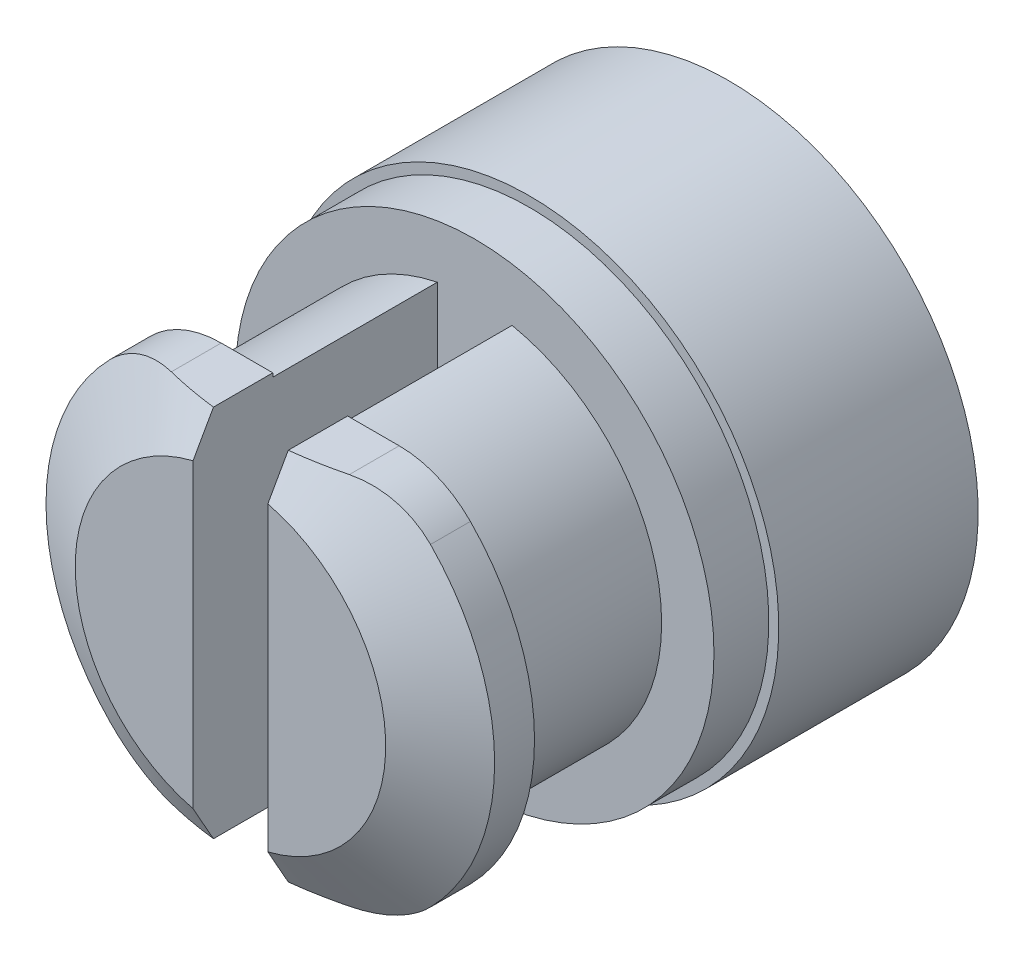
ISO-10303-21;
HEADER;
FILE_DESCRIPTION(('STEP AP214'),'2;1');
FILE_NAME('part.step','',(''),(''),'','','');
FILE_SCHEMA(('AUTOMOTIVE_DESIGN { 1 0 10303 214 1 1 1 1 }'));
ENDSEC;
DATA;
#1=APPLICATION_CONTEXT('core data for automotive mechanical design processes');
#2=APPLICATION_PROTOCOL_DEFINITION('international standard','automotive_design',2000,#1);
#3=PRODUCT_CONTEXT('',#1,'mechanical');
#4=PRODUCT('Part','Part','',(#3));
#5=PRODUCT_RELATED_PRODUCT_CATEGORY('part','',(#4));
#6=PRODUCT_DEFINITION_FORMATION('','',#4);
#7=PRODUCT_DEFINITION_CONTEXT('part definition',#1,'design');
#8=PRODUCT_DEFINITION('design','',#6,#7);
#9=PRODUCT_DEFINITION_SHAPE('','',#8);
#10=(LENGTH_UNIT() NAMED_UNIT(*) SI_UNIT(.MILLI.,.METRE.));
#11=(NAMED_UNIT(*) PLANE_ANGLE_UNIT() SI_UNIT($,.RADIAN.));
#12=(NAMED_UNIT(*) SI_UNIT($,.STERADIAN.) SOLID_ANGLE_UNIT());
#13=UNCERTAINTY_MEASURE_WITH_UNIT(LENGTH_MEASURE(1.E-05),#10,'distance_accuracy_value','');
#14=(GEOMETRIC_REPRESENTATION_CONTEXT(3) GLOBAL_UNCERTAINTY_ASSIGNED_CONTEXT((#13)) GLOBAL_UNIT_ASSIGNED_CONTEXT((#10,
#11,#12)) REPRESENTATION_CONTEXT('',''));
#15=CARTESIAN_POINT('',(0.,0.,0.));
#16=DIRECTION('',(0.,0.,1.));
#17=DIRECTION('',(1.,0.,0.));
#18=AXIS2_PLACEMENT_3D('',#15,#16,#17);
#19=CARTESIAN_POINT('',(0.,0.,3.));
#20=DIRECTION('',(0.,0.,-1.));
#21=DIRECTION('',(-1.,0.,0.));
#22=AXIS2_PLACEMENT_3D('',#19,#20,#21);
#23=CYLINDRICAL_SURFACE('',#22,2.25);
#24=CARTESIAN_POINT('',(0.,0.,2.2));
#25=DIRECTION('',(0.,0.,1.));
#26=DIRECTION('',(1.,0.,0.));
#27=AXIS2_PLACEMENT_3D('',#24,#25,#26);
#28=CIRCLE('',#27,2.25);
#29=CARTESIAN_POINT('',(1.60682139642214,-1.575,2.2));
#30=VERTEX_POINT('',#29);
#31=CARTESIAN_POINT('',(1.60682139642214,1.575,2.2));
#32=VERTEX_POINT('',#31);
#33=EDGE_CURVE('E313',#30,#32,#28,.T.);
#34=ORIENTED_EDGE('',*,*,#33,.T.);
#35=DIRECTION('',(0.,0.,-1.));
#36=VECTOR('',#35,1.);
#37=CARTESIAN_POINT('',(1.60682139642214,1.575,3.));
#38=LINE('',#37,#36);
#39=CARTESIAN_POINT('',(1.60682139642214,1.575,2.6));
#40=VERTEX_POINT('',#39);
#41=EDGE_CURVE('E271',#32,#40,#38,.F.);
#42=ORIENTED_EDGE('',*,*,#41,.T.);
#43=CARTESIAN_POINT('',(0.,0.,2.6));
#44=DIRECTION('',(0.,0.,1.));
#45=DIRECTION('',(1.,0.,0.));
#46=AXIS2_PLACEMENT_3D('',#43,#44,#45);
#47=CIRCLE('',#46,2.25);
#48=CARTESIAN_POINT('',(1.60682139642214,-1.575,2.6));
#49=VERTEX_POINT('',#48);
#50=EDGE_CURVE('E239',#40,#49,#47,.F.);
#51=ORIENTED_EDGE('',*,*,#50,.T.);
#52=DIRECTION('',(0.,0.,-1.));
#53=VECTOR('',#52,1.);
#54=CARTESIAN_POINT('',(1.60682139642214,-1.575,3.));
#55=LINE('',#54,#53);
#56=EDGE_CURVE('E308',#49,#30,#55,.T.);
#57=ORIENTED_EDGE('',*,*,#56,.T.);
#58=EDGE_LOOP('',(#34,#42,#51,#57));
#59=FACE_BOUND('',#58,.T.);
#60=ADVANCED_FACE('F33',(#59),#23,.T.);
#61=CARTESIAN_POINT('',(0.,0.,2.2));
#62=DIRECTION('',(0.,0.,1.));
#63=DIRECTION('',(1.,0.,0.));
#64=AXIS2_PLACEMENT_3D('',#61,#62,#63);
#65=PLANE('',#64);
#66=DIRECTION('',(-1.,0.,0.));
#67=VECTOR('',#66,1.);
#68=CARTESIAN_POINT('',(0.,1.875,2.2));
#69=LINE('',#68,#67);
#70=CARTESIAN_POINT('',(0.892678553567856,1.875,2.2));
#71=VERTEX_POINT('',#70);
#72=CARTESIAN_POINT('',(0.375,1.875,2.2));
#73=VERTEX_POINT('',#72);
#74=EDGE_CURVE('E160',#71,#73,#69,.T.);
#75=ORIENTED_EDGE('',*,*,#74,.F.);
#76=CARTESIAN_POINT('',(0.892678553567856,0.875,2.2));
#77=DIRECTION('',(0.,0.,1.));
#78=DIRECTION('',(1.,0.,0.));
#79=AXIS2_PLACEMENT_3D('',#76,#77,#78);
#80=CIRCLE('',#79,1.);
#81=EDGE_CURVE('E307',#71,#32,#80,.F.);
#82=ORIENTED_EDGE('',*,*,#81,.T.);
#83=ORIENTED_EDGE('',*,*,#33,.F.);
#84=CARTESIAN_POINT('',(0.892678553567856,-0.875,2.2));
#85=DIRECTION('',(0.,0.,1.));
#86=DIRECTION('',(1.,0.,0.));
#87=AXIS2_PLACEMENT_3D('',#84,#85,#86);
#88=CIRCLE('',#87,1.);
#89=CARTESIAN_POINT('',(0.892678553567856,-1.875,2.2));
#90=VERTEX_POINT('',#89);
#91=EDGE_CURVE('E305',#30,#90,#88,.F.);
#92=ORIENTED_EDGE('',*,*,#91,.T.);
#93=DIRECTION('',(1.,0.,0.));
#94=VECTOR('',#93,1.);
#95=CARTESIAN_POINT('',(0.,-1.875,2.2));
#96=LINE('',#95,#94);
#97=CARTESIAN_POINT('',(0.375,-1.875,2.2));
#98=VERTEX_POINT('',#97);
#99=EDGE_CURVE('E323',#98,#90,#96,.T.);
#100=ORIENTED_EDGE('',*,*,#99,.F.);
#101=DIRECTION('',(0.,1.,0.));
#102=VECTOR('',#101,1.);
#103=CARTESIAN_POINT('',(0.375,0.,2.2));
#104=LINE('',#103,#102);
#105=CARTESIAN_POINT('',(0.375,-1.83711730708738,2.2));
#106=VERTEX_POINT('',#105);
#107=EDGE_CURVE('E185',#98,#106,#104,.T.);
#108=ORIENTED_EDGE('',*,*,#107,.T.);
#109=CARTESIAN_POINT('',(0.,0.,2.2));
#110=DIRECTION('',(0.,0.,1.));
#111=DIRECTION('',(1.,0.,0.));
#112=AXIS2_PLACEMENT_3D('',#109,#110,#111);
#113=CIRCLE('',#112,1.875);
#114=CARTESIAN_POINT('',(0.375,1.83711730708738,2.2));
#115=VERTEX_POINT('',#114);
#116=EDGE_CURVE('E184',#106,#115,#113,.T.);
#117=ORIENTED_EDGE('',*,*,#116,.T.);
#118=EDGE_CURVE('E175',#115,#73,#104,.T.);
#119=ORIENTED_EDGE('',*,*,#118,.T.);
#120=EDGE_LOOP('',(#75,#82,#83,#92,#100,#108,#117,#119));
#121=FACE_BOUND('',#120,.T.);
#122=ADVANCED_FACE('F182',(#121),#65,.F.);
#123=CARTESIAN_POINT('',(0.,0.,2.6));
#124=DIRECTION('',(0.,0.,1.));
#125=DIRECTION('',(1.,0.,0.));
#126=AXIS2_PLACEMENT_3D('',#123,#124,#125);
#127=CIRCLE('',#126,2.25);
#128=CARTESIAN_POINT('',(-1.60682139642214,-1.575,2.6));
#129=VERTEX_POINT('',#128);
#130=CARTESIAN_POINT('',(-1.60682139642214,1.575,2.6));
#131=VERTEX_POINT('',#130);
#132=EDGE_CURVE('E333',#129,#131,#127,.F.);
#133=ORIENTED_EDGE('',*,*,#132,.T.);
#134=DIRECTION('',(0.,0.,-1.));
#135=VECTOR('',#134,1.);
#136=CARTESIAN_POINT('',(-1.60682139642214,1.575,3.));
#137=LINE('',#136,#135);
#138=CARTESIAN_POINT('',(-1.60682139642214,1.575,2.2));
#139=VERTEX_POINT('',#138);
#140=EDGE_CURVE('E298',#131,#139,#137,.T.);
#141=ORIENTED_EDGE('',*,*,#140,.T.);
#142=CARTESIAN_POINT('',(-1.60682139642214,-1.575,2.2));
#143=VERTEX_POINT('',#142);
#144=EDGE_CURVE('E318',#139,#143,#28,.T.);
#145=ORIENTED_EDGE('',*,*,#144,.T.);
#146=DIRECTION('',(0.,0.,-1.));
#147=VECTOR('',#146,1.);
#148=CARTESIAN_POINT('',(-1.60682139642214,-1.575,3.));
#149=LINE('',#148,#147);
#150=EDGE_CURVE('E296',#143,#129,#149,.F.);
#151=ORIENTED_EDGE('',*,*,#150,.T.);
#152=EDGE_LOOP('',(#133,#141,#145,#151));
#153=FACE_BOUND('',#152,.T.);
#154=ADVANCED_FACE('F418',(#153),#23,.T.);
#155=ORIENTED_EDGE('',*,*,#144,.F.);
#156=CARTESIAN_POINT('',(-0.892678553567856,0.875,2.2));
#157=DIRECTION('',(0.,0.,1.));
#158=DIRECTION('',(1.,0.,0.));
#159=AXIS2_PLACEMENT_3D('',#156,#157,#158);
#160=CIRCLE('',#159,1.);
#161=CARTESIAN_POINT('',(-0.892678553567856,1.875,2.2));
#162=VERTEX_POINT('',#161);
#163=EDGE_CURVE('E302',#139,#162,#160,.F.);
#164=ORIENTED_EDGE('',*,*,#163,.T.);
#165=DIRECTION('',(-1.,0.,0.));
#166=VECTOR('',#165,1.);
#167=CARTESIAN_POINT('',(0.,1.875,2.2));
#168=LINE('',#167,#166);
#169=CARTESIAN_POINT('',(-0.375,1.875,2.2));
#170=VERTEX_POINT('',#169);
#171=EDGE_CURVE('E439',#170,#162,#168,.T.);
#172=ORIENTED_EDGE('',*,*,#171,.F.);
#173=DIRECTION('',(0.,-1.,0.));
#174=VECTOR('',#173,1.);
#175=CARTESIAN_POINT('',(-0.375,0.,2.2));
#176=LINE('',#175,#174);
#177=CARTESIAN_POINT('',(-0.375,1.83711730708738,2.2));
#178=VERTEX_POINT('',#177);
#179=EDGE_CURVE('E186',#170,#178,#176,.T.);
#180=ORIENTED_EDGE('',*,*,#179,.T.);
#181=CARTESIAN_POINT('',(-0.375,-1.83711730708738,2.2));
#182=VERTEX_POINT('',#181);
#183=EDGE_CURVE('E367',#178,#182,#113,.T.);
#184=ORIENTED_EDGE('',*,*,#183,.T.);
#185=CARTESIAN_POINT('',(-0.375,-1.875,2.2));
#186=VERTEX_POINT('',#185);
#187=EDGE_CURVE('E189',#182,#186,#176,.T.);
#188=ORIENTED_EDGE('',*,*,#187,.T.);
#189=DIRECTION('',(1.,0.,0.));
#190=VECTOR('',#189,1.);
#191=CARTESIAN_POINT('',(0.,-1.875,2.2));
#192=LINE('',#191,#190);
#193=CARTESIAN_POINT('',(-0.892678553567856,-1.875,2.2));
#194=VERTEX_POINT('',#193);
#195=EDGE_CURVE('E335',#194,#186,#192,.T.);
#196=ORIENTED_EDGE('',*,*,#195,.F.);
#197=CARTESIAN_POINT('',(-0.892678553567856,-0.875,2.2));
#198=DIRECTION('',(0.,0.,1.));
#199=DIRECTION('',(1.,0.,0.));
#200=AXIS2_PLACEMENT_3D('',#197,#198,#199);
#201=CIRCLE('',#200,1.);
#202=EDGE_CURVE('E300',#194,#143,#201,.F.);
#203=ORIENTED_EDGE('',*,*,#202,.T.);
#204=EDGE_LOOP('',(#155,#164,#172,#180,#184,#188,#196,#203));
#205=FACE_BOUND('',#204,.T.);
#206=ADVANCED_FACE('F224',(#205),#65,.F.);
#207=CARTESIAN_POINT('',(0.375,-3.03688498979674,-5.56990047018831));
#208=DIRECTION('',(1.,0.,0.));
#209=DIRECTION('',(0.,0.,-1.));
#210=AXIS2_PLACEMENT_3D('',#207,#208,#209);
#211=PLANE('',#210);
#212=DIRECTION('',(0.,0.,-1.));
#213=VECTOR('',#212,1.);
#214=CARTESIAN_POINT('',(0.375,-1.875,-5.56990047018831));
#215=LINE('',#214,#213);
#216=CARTESIAN_POINT('',(0.374999999984532,-1.875,2.79506799738743));
#217=VERTEX_POINT('',#216);
#218=EDGE_CURVE('E444',#217,#98,#215,.T.);
#219=ORIENTED_EDGE('',*,*,#218,.F.);
#220=CARTESIAN_POINT('',(0.375,-2.21852991866236,2.6));
#221=CARTESIAN_POINT('',(0.375,-2.15968993372952,2.63349497391052));
#222=CARTESIAN_POINT('',(0.375,-2.1008350115622,2.66696375090653));
#223=CARTESIAN_POINT('',(0.375,-1.98308452700175,2.73382935955814));
#224=CARTESIAN_POINT('',(0.375,-1.9241889647183,2.76722619140692));
#225=CARTESIAN_POINT('',(0.375,-1.80634603920087,2.83392858311246));
#226=CARTESIAN_POINT('',(0.375,-1.7473986758978,2.86723414284722));
#227=CARTESIAN_POINT('',(0.375,-1.6294330290731,2.93371977517085));
#228=CARTESIAN_POINT('',(0.375,-1.57041474535898,2.9668998474181));
#229=CARTESIAN_POINT('',(0.375,-1.51135156279934,3.));
#230=B_SPLINE_CURVE_WITH_KNOTS('',3,(#220,#221,#222,#223,#224,#225,#226,#227,#228,#229),
.UNSPECIFIED.,.F.,.F.,(4,2,2,2,4),(0.,0.203117017816693,0.406233489563518,0.60935023263841,
0.812467528260209),.UNSPECIFIED.);
#231=CARTESIAN_POINT('',(0.375,-1.51135156279934,3.));
#232=VERTEX_POINT('',#231);
#233=EDGE_CURVE('E229',#217,#232,#230,.T.);
#234=ORIENTED_EDGE('',*,*,#233,.T.);
#235=DIRECTION('',(0.,1.,0.));
#236=VECTOR('',#235,1.);
#237=CARTESIAN_POINT('',(0.375,-3.03688498979674,3.));
#238=LINE('',#237,#236);
#239=CARTESIAN_POINT('',(0.375,1.51135156279934,3.));
#240=VERTEX_POINT('',#239);
#241=EDGE_CURVE('E332',#232,#240,#238,.T.);
#242=ORIENTED_EDGE('',*,*,#241,.T.);
#243=CARTESIAN_POINT('',(0.375,1.51135156279934,3.));
#244=CARTESIAN_POINT('',(0.375,1.57041474535898,2.9668998474181));
#245=CARTESIAN_POINT('',(0.375,1.6294330290731,2.93371977517085));
#246=CARTESIAN_POINT('',(0.375,1.7473986758978,2.86723414284722));
#247=CARTESIAN_POINT('',(0.375,1.80634603920088,2.83392858311246));
#248=CARTESIAN_POINT('',(0.375,1.9241889647183,2.76722619140692));
#249=CARTESIAN_POINT('',(0.375,1.98308452700175,2.73382935955814));
#250=CARTESIAN_POINT('',(0.375,2.1008350115622,2.66696375090653));
#251=CARTESIAN_POINT('',(0.375,2.15968993372952,2.63349497391052));
#252=CARTESIAN_POINT('',(0.375,2.21852991866236,2.6));
#253=B_SPLINE_CURVE_WITH_KNOTS('',3,(#243,#244,#245,#246,#247,#248,#249,#250,#251,#252),
.UNSPECIFIED.,.F.,.F.,(4,2,2,2,4),(0.,0.203117295621798,0.406234038696691,0.609350510443516,
0.812467528260209),.UNSPECIFIED.);
#254=CARTESIAN_POINT('',(0.375,1.875,2.79506799738568));
#255=VERTEX_POINT('',#254);
#256=EDGE_CURVE('E178',#240,#255,#253,.T.);
#257=ORIENTED_EDGE('',*,*,#256,.T.);
#258=DIRECTION('',(0.,0.,1.));
#259=VECTOR('',#258,1.);
#260=CARTESIAN_POINT('',(0.375,1.875,-5.56990047018831));
#261=LINE('',#260,#259);
#262=EDGE_CURVE('E164',#73,#255,#261,.T.);
#263=ORIENTED_EDGE('',*,*,#262,.F.);
#264=ORIENTED_EDGE('',*,*,#118,.F.);
#265=DIRECTION('',(0.,0.,-1.));
#266=VECTOR('',#265,1.);
#267=CARTESIAN_POINT('',(0.375,1.83711730708738,2.2));
#268=LINE('',#267,#266);
#269=CARTESIAN_POINT('',(0.375,1.83711730708738,0.55));
#270=VERTEX_POINT('',#269);
#271=EDGE_CURVE('E352',#270,#115,#268,.F.);
#272=ORIENTED_EDGE('',*,*,#271,.F.);
#273=DIRECTION('',(0.,-1.,0.));
#274=VECTOR('',#273,1.);
#275=CARTESIAN_POINT('',(0.375,-3.03688498979674,0.55));
#276=LINE('',#275,#274);
#277=CARTESIAN_POINT('',(0.375,-1.83711730708738,0.55));
#278=VERTEX_POINT('',#277);
#279=EDGE_CURVE('E343',#270,#278,#276,.T.);
#280=ORIENTED_EDGE('',*,*,#279,.T.);
#281=DIRECTION('',(0.,0.,-1.));
#282=VECTOR('',#281,1.);
#283=CARTESIAN_POINT('',(0.375,-1.83711730708738,2.2));
#284=LINE('',#283,#282);
#285=EDGE_CURVE('E319',#106,#278,#284,.T.);
#286=ORIENTED_EDGE('',*,*,#285,.F.);
#287=ORIENTED_EDGE('',*,*,#107,.F.);
#288=EDGE_LOOP('',(#219,#234,#242,#257,#263,#264,#272,#280,#286,#287));
#289=FACE_BOUND('',#288,.T.);
#290=ADVANCED_FACE('F174',(#289),#211,.F.);
#291=CARTESIAN_POINT('',(-0.375,-3.03688498979674,-5.56990047018831));
#292=DIRECTION('',(-1.,0.,0.));
#293=DIRECTION('',(0.,0.,1.));
#294=AXIS2_PLACEMENT_3D('',#291,#292,#293);
#295=PLANE('',#294);
#296=DIRECTION('',(0.,0.,1.));
#297=VECTOR('',#296,1.);
#298=CARTESIAN_POINT('',(-0.375,-1.875,-5.56990047018831));
#299=LINE('',#298,#297);
#300=CARTESIAN_POINT('',(-0.375,-1.875,2.79506799738568));
#301=VERTEX_POINT('',#300);
#302=EDGE_CURVE('E340',#186,#301,#299,.T.);
#303=ORIENTED_EDGE('',*,*,#302,.F.);
#304=ORIENTED_EDGE('',*,*,#187,.F.);
#305=DIRECTION('',(0.,0.,-1.));
#306=VECTOR('',#305,1.);
#307=CARTESIAN_POINT('',(-0.375,-1.83711730708738,2.2));
#308=LINE('',#307,#306);
#309=CARTESIAN_POINT('',(-0.375,-1.83711730708738,0.55));
#310=VERTEX_POINT('',#309);
#311=EDGE_CURVE('E346',#310,#182,#308,.F.);
#312=ORIENTED_EDGE('',*,*,#311,.F.);
#313=DIRECTION('',(0.,1.,0.));
#314=VECTOR('',#313,1.);
#315=CARTESIAN_POINT('',(-0.375,-3.03688498979674,0.55));
#316=LINE('',#315,#314);
#317=CARTESIAN_POINT('',(-0.375,1.83711730708738,0.55));
#318=VERTEX_POINT('',#317);
#319=EDGE_CURVE('E338',#310,#318,#316,.T.);
#320=ORIENTED_EDGE('',*,*,#319,.T.);
#321=DIRECTION('',(0.,0.,-1.));
#322=VECTOR('',#321,1.);
#323=CARTESIAN_POINT('',(-0.375,1.83711730708738,2.2));
#324=LINE('',#323,#322);
#325=EDGE_CURVE('E349',#178,#318,#324,.T.);
#326=ORIENTED_EDGE('',*,*,#325,.F.);
#327=ORIENTED_EDGE('',*,*,#179,.F.);
#328=DIRECTION('',(0.,0.,-1.));
#329=VECTOR('',#328,1.);
#330=CARTESIAN_POINT('',(-0.375,1.875,-5.56990047018831));
#331=LINE('',#330,#329);
#332=CARTESIAN_POINT('',(-0.374999999984535,1.875,2.79506799738743));
#333=VERTEX_POINT('',#332);
#334=EDGE_CURVE('E443',#333,#170,#331,.T.);
#335=ORIENTED_EDGE('',*,*,#334,.F.);
#336=CARTESIAN_POINT('',(-0.375,2.21852991866236,2.6));
#337=CARTESIAN_POINT('',(-0.375,2.15968993372952,2.63349497391052));
#338=CARTESIAN_POINT('',(-0.375,2.1008350115622,2.66696375090653));
#339=CARTESIAN_POINT('',(-0.375,1.98308452700175,2.73382935955814));
#340=CARTESIAN_POINT('',(-0.375,1.9241889647183,2.76722619140692));
#341=CARTESIAN_POINT('',(-0.375,1.80634603920088,2.83392858311246));
#342=CARTESIAN_POINT('',(-0.375,1.7473986758978,2.86723414284722));
#343=CARTESIAN_POINT('',(-0.375,1.6294330290731,2.93371977517085));
#344=CARTESIAN_POINT('',(-0.375,1.57041474535898,2.9668998474181));
#345=CARTESIAN_POINT('',(-0.375,1.51135156279934,3.));
#346=B_SPLINE_CURVE_WITH_KNOTS('',3,(#336,#337,#338,#339,#340,#341,#342,#343,#344,#345),
.UNSPECIFIED.,.F.,.F.,(4,2,2,2,4),(0.,0.203117017816693,0.406233489563517,0.60935023263841,
0.812467528260208),.UNSPECIFIED.);
#347=CARTESIAN_POINT('',(-0.375,1.51135156279934,3.));
#348=VERTEX_POINT('',#347);
#349=EDGE_CURVE('E195',#333,#348,#346,.T.);
#350=ORIENTED_EDGE('',*,*,#349,.T.);
#351=DIRECTION('',(0.,-1.,0.));
#352=VECTOR('',#351,1.);
#353=CARTESIAN_POINT('',(-0.375,-3.03688498979674,3.));
#354=LINE('',#353,#352);
#355=CARTESIAN_POINT('',(-0.375,-1.51135156279934,3.));
#356=VERTEX_POINT('',#355);
#357=EDGE_CURVE('E334',#348,#356,#354,.T.);
#358=ORIENTED_EDGE('',*,*,#357,.T.);
#359=CARTESIAN_POINT('',(-0.375,-1.51135156279934,3.));
#360=CARTESIAN_POINT('',(-0.375,-1.57041474535898,2.9668998474181));
#361=CARTESIAN_POINT('',(-0.375,-1.6294330290731,2.93371977517085));
#362=CARTESIAN_POINT('',(-0.375,-1.7473986758978,2.86723414284722));
#363=CARTESIAN_POINT('',(-0.375,-1.80634603920088,2.83392858311246));
#364=CARTESIAN_POINT('',(-0.375,-1.9241889647183,2.76722619140692));
#365=CARTESIAN_POINT('',(-0.375,-1.98308452700175,2.73382935955814));
#366=CARTESIAN_POINT('',(-0.375,-2.1008350115622,2.66696375090653));
#367=CARTESIAN_POINT('',(-0.375,-2.15968993372952,2.63349497391052));
#368=CARTESIAN_POINT('',(-0.375,-2.21852991866236,2.6));
#369=B_SPLINE_CURVE_WITH_KNOTS('',3,(#359,#360,#361,#362,#363,#364,#365,#366,#367,#368),
.UNSPECIFIED.,.F.,.F.,(4,2,2,2,4),(0.,0.203117295621798,0.406234038696691,0.609350510443516,
0.812467528260208),.UNSPECIFIED.);
#370=EDGE_CURVE('E202',#356,#301,#369,.T.);
#371=ORIENTED_EDGE('',*,*,#370,.T.);
#372=EDGE_LOOP('',(#303,#304,#312,#320,#326,#327,#335,#350,#358,#371));
#373=FACE_BOUND('',#372,.T.);
#374=ADVANCED_FACE('F211',(#373),#295,.F.);
#375=CARTESIAN_POINT('',(0.,0.,3.));
#376=DIRECTION('',(0.,0.,-1.));
#377=DIRECTION('',(-1.,0.,0.));
#378=AXIS2_PLACEMENT_3D('',#375,#376,#377);
#379=CONICAL_SURFACE('',#378,1.55717967697245,1.0471975511966);
#380=CARTESIAN_POINT('',(0.77551517420227,1.875,2.72756484727964));
#381=CARTESIAN_POINT('',(0.73007828212685,1.875,2.73759139971199));
#382=CARTESIAN_POINT('',(0.684483458480379,1.875,2.746899537944));
#383=CARTESIAN_POINT('',(0.592987609596221,1.875,2.76393435069116));
#384=CARTESIAN_POINT('',(0.547086506149714,1.875,2.77166060396105));
#385=CARTESIAN_POINT('',(0.408946001671618,1.875,2.7922462534341));
#386=CARTESIAN_POINT('',(0.316297737646359,1.875,2.80250610976308));
#387=CARTESIAN_POINT('',(0.132574886718153,1.875,2.81505167553006));
#388=CARTESIAN_POINT('',(0.0415124790875966,1.875,2.81751356952369));
#389=CARTESIAN_POINT('',(-0.140443547775259,1.875,2.81474583153236));
#390=CARTESIAN_POINT('',(-0.231337228826834,1.875,2.8095200636123));
#391=CARTESIAN_POINT('',(-0.455475822604413,1.875,2.78761389509424));
#392=CARTESIAN_POINT('',(-0.588304374029833,1.875,2.76666788057498));
#393=CARTESIAN_POINT('',(-0.851406700487641,1.875,2.7122656984015));
#394=CARTESIAN_POINT('',(-0.981677227305159,1.875,2.67879458684475));
#395=CARTESIAN_POINT('',(-1.17604125726333,1.875,2.62160020743556));
#396=CARTESIAN_POINT('',(-1.24114693883111,1.875,2.60118805420931));
#397=CARTESIAN_POINT('',(-1.37068250354892,1.875,2.55844461124686));
#398=CARTESIAN_POINT('',(-1.43511277578087,1.875,2.53611450327038));
#399=CARTESIAN_POINT('',(-1.62750898786172,1.875,2.46675107355756));
#400=CARTESIAN_POINT('',(-1.75461323428828,1.875,2.41733459221373));
#401=CARTESIAN_POINT('',(-2.01195940339039,1.875,2.31210681333425));
#402=CARTESIAN_POINT('',(-2.142128637828,1.875,2.25612063741134));
#403=CARTESIAN_POINT('',(-2.40101010191744,1.875,2.14084744040797));
#404=CARTESIAN_POINT('',(-2.52972212733652,1.875,2.08155996336499));
#405=CARTESIAN_POINT('',(-2.78257485708802,1.875,1.96227436589369));
#406=CARTESIAN_POINT('',(-2.90674517642836,1.875,1.90233861984275));
#407=CARTESIAN_POINT('',(-3.15421335212192,1.875,1.78081684916808));
#408=CARTESIAN_POINT('',(-3.27751154820572,1.875,1.71923151761987));
#409=CARTESIAN_POINT('',(-3.40051517420227,1.875,1.65707999946831));
#410=B_SPLINE_CURVE_WITH_KNOTS('',3,(#380,#381,#382,#383,#384,#385,#386,#387,#388,#389,#390,
#391,#392,#393,#394,#395,#396,#397,#398,#399,#400,#401,#402,#403,#404,#405,#406,#407,#408,#409),
.UNSPECIFIED.,.F.,.F.,(4,2,2,2,2,2,2,2,2,2,2,2,2,2,4),(0.,0.139580379396184,0.279197879897776,
0.558519829828359,0.8314841235008,1.10431126345209,1.50688805165974,1.90994670040144,
2.11461530128089,2.31915868677931,2.72814235593344,3.153180427448,3.57827734983895,
3.99190030295551,4.40535211655301),.UNSPECIFIED.);
#411=CARTESIAN_POINT('',(-0.892678553567855,1.875,2.70008022484848));
#412=VERTEX_POINT('',#411);
#413=EDGE_CURVE('E170',#333,#412,#410,.T.);
#414=ORIENTED_EDGE('',*,*,#413,.T.);
#415=CARTESIAN_POINT('',(-0.892678553567856,1.875,2.70008022484848));
#416=CARTESIAN_POINT('',(-0.919581790580037,1.87499983517563,2.69340360643589));
#417=CARTESIAN_POINT('',(-0.94654864301284,1.87391341656568,2.68703072337631));
#418=CARTESIAN_POINT('',(-1.00044976138333,1.86954390462788,2.67490951054497));
#419=CARTESIAN_POINT('',(-1.02738402007079,1.86626038960332,2.66916130091531));
#420=CARTESIAN_POINT('',(-1.10791571295614,1.85307311644857,2.65287627710788));
#421=CARTESIAN_POINT('',(-1.16120835369302,1.83983256941054,2.64330737833321));
#422=CARTESIAN_POINT('',(-1.26534131029021,1.80459930711908,2.62692212436111));
#423=CARTESIAN_POINT('',(-1.31617715300775,1.78259125553994,2.62011063480731));
#424=CARTESIAN_POINT('',(-1.41366726018164,1.7303448689643,2.60938810574547));
#425=CARTESIAN_POINT('',(-1.46033087695269,1.70012558765332,2.6054704286141));
#426=CARTESIAN_POINT('',(-1.52229920166895,1.65224258491577,2.60201917017177));
#427=CARTESIAN_POINT('',(-1.53994714437921,1.63760728908143,2.60126190377883));
#428=CARTESIAN_POINT('',(-1.57418774762092,1.60716680802337,2.60025279510879));
#429=CARTESIAN_POINT('',(-1.59078142830412,1.59136278678122,2.60000045679946));
#430=CARTESIAN_POINT('',(-1.60682139642215,1.57500000000001,2.59999999999999));
#431=B_SPLINE_CURVE_WITH_KNOTS('',3,(#415,#416,#417,#418,#419,#420,#421,#422,#423,#424,#425,
#426,#427,#428,#429,#430),.UNSPECIFIED.,.F.,.F.,(4,2,2,2,2,2,2,4),(0.,0.0831109703284132,
0.16623789702544,0.332594627386356,0.499243639650409,0.665509206948275,0.734279159715779,
0.802981520892255),.UNSPECIFIED.);
#432=EDGE_CURVE('E290',#412,#131,#431,.T.);
#433=ORIENTED_EDGE('',*,*,#432,.T.);
#434=ORIENTED_EDGE('',*,*,#132,.F.);
#435=CARTESIAN_POINT('',(-1.60682139642214,-1.575,2.6));
#436=CARTESIAN_POINT('',(-1.58786242240055,-1.59434249156085,2.60000035901196));
#437=CARTESIAN_POINT('',(-1.56812602686401,-1.61290406844184,2.60035314785149));
#438=CARTESIAN_POINT('',(-1.52723062387886,-1.64835408145434,2.60176225771524));
#439=CARTESIAN_POINT('',(-1.50607175665551,-1.6652426821007,2.60281850948425));
#440=CARTESIAN_POINT('',(-1.44075031834378,-1.71316684951496,2.60703435041968));
#441=CARTESIAN_POINT('',(-1.39465793156051,-1.74154724231284,2.61124104509327));
#442=CARTESIAN_POINT('',(-1.29878986773541,-1.79040991182473,2.62237405449017));
#443=CARTESIAN_POINT('',(-1.24901298871822,-1.81088959747155,2.62930125991495));
#444=CARTESIAN_POINT('',(-1.14723553087395,-1.84352939350739,2.64576186529167));
#445=CARTESIAN_POINT('',(-1.09523688643385,-1.85569659044794,2.65529303558515));
#446=CARTESIAN_POINT('',(-1.01790981709724,-1.86745115807895,2.67117401293372));
#447=CARTESIAN_POINT('',(-0.992837887320423,-1.87028978770985,2.67658505946397));
#448=CARTESIAN_POINT('',(-0.94271862695668,-1.87406227341835,2.6879374154138));
#449=CARTESIAN_POINT('',(-0.917671334484993,-1.87499958215895,2.69387774317316));
#450=CARTESIAN_POINT('',(-0.892678553567861,-1.8750000000001,2.70008022484843));
#451=B_SPLINE_CURVE_WITH_KNOTS('',3,(#435,#436,#437,#438,#439,#440,#441,#442,#443,#444,#445,
#446,#447,#448,#449,#450),.UNSPECIFIED.,.F.,.F.,(4,2,2,2,2,2,2,4),(0.,0.0812024122390972,
0.162396831363084,0.32442668667394,0.486509635215342,0.648454232016024,0.725807777349448,
0.803020727962151),.UNSPECIFIED.);
#452=CARTESIAN_POINT('',(-0.892678553567856,-1.875,2.70008022484848));
#453=VERTEX_POINT('',#452);
#454=EDGE_CURVE('E285',#129,#453,#451,.T.);
#455=ORIENTED_EDGE('',*,*,#454,.T.);
#456=CARTESIAN_POINT('',(-3.40051517420227,-1.875,1.65707999946831));
#457=CARTESIAN_POINT('',(-3.32011162089172,-1.875,1.69772691992684));
#458=CARTESIAN_POINT('',(-3.23957562365413,-1.875,1.738113315058));
#459=CARTESIAN_POINT('',(-3.07818183879897,-1.875,1.81824314469414));
#460=CARTESIAN_POINT('',(-2.99732404238453,-1.875,1.85798656146984));
#461=CARTESIAN_POINT('',(-2.75389341781242,-1.875,1.97620979858071));
#462=CARTESIAN_POINT('',(-2.59075644623671,-1.875,2.05353333071429));
#463=CARTESIAN_POINT('',(-2.25612297687946,-1.875,2.20643046487578));
#464=CARTESIAN_POINT('',(-2.08454399141789,-1.875,2.28182666336692));
#465=CARTESIAN_POINT('',(-1.82474931588355,-1.875,2.38888213201205));
#466=CARTESIAN_POINT('',(-1.73777809093127,-1.875,2.42354955802523));
#467=CARTESIAN_POINT('',(-1.56281577403669,-1.875,2.49029250572316));
#468=CARTESIAN_POINT('',(-1.47482442792011,-1.875,2.52236736485071));
#469=CARTESIAN_POINT('',(-1.27882811849963,-1.875,2.58964173794156));
#470=CARTESIAN_POINT('',(-1.17054848362292,-1.875,2.6240539229425));
#471=CARTESIAN_POINT('',(-0.952105095623162,-1.875,2.68617461098296));
#472=CARTESIAN_POINT('',(-0.841942402764985,-1.875,2.71388676149848));
#473=CARTESIAN_POINT('',(-0.621195669234504,-1.875,2.76016488645846));
#474=CARTESIAN_POINT('',(-0.510636881117496,-1.875,2.77884800865324));
#475=CARTESIAN_POINT('',(-0.288261129882072,-1.875,2.8055782809547));
#476=CARTESIAN_POINT('',(-0.17644519999446,-1.875,2.81363360140799));
#477=CARTESIAN_POINT('',(0.00545180732221563,-1.875,2.8172610219293));
#478=CARTESIAN_POINT('',(0.0754776713002962,-1.875,2.81637874224703));
#479=CARTESIAN_POINT('',(0.21534774413693,-1.875,2.81013279317167));
#480=CARTESIAN_POINT('',(0.285191909027752,-1.875,2.80476812497092));
#481=CARTESIAN_POINT('',(0.425532151849086,-1.875,2.7897028955105));
#482=CARTESIAN_POINT('',(0.49602072996198,-1.875,2.77993420114444));
#483=CARTESIAN_POINT('',(0.636311737806757,-1.875,2.7565292485376));
#484=CARTESIAN_POINT('',(0.706114568588122,-1.875,2.7428954096622));
#485=CARTESIAN_POINT('',(0.77551517420227,-1.875,2.72756484727964));
#486=B_SPLINE_CURVE_WITH_KNOTS('',3,(#456,#457,#458,#459,#460,#461,#462,#463,#464,#465,#466,
#467,#468,#469,#470,#471,#472,#473,#474,#475,#476,#477,#478,#479,#480,#481,#482,#483,#484,#485),
.UNSPECIFIED.,.F.,.F.,(4,2,2,2,2,2,2,2,2,2,2,2,2,2,4),(0.,0.270281856000906,0.540571152012483,
1.08213634234131,1.64422777062576,1.92507376251642,2.20599130204925,2.54668229516279,
2.88718739751276,3.22314735507867,3.55884888555887,3.76880859503538,3.97881510217545,
4.19218837931096,4.40542839042843),.UNSPECIFIED.);
#487=EDGE_CURVE('E394',#453,#301,#486,.T.);
#488=ORIENTED_EDGE('',*,*,#487,.T.);
#489=ORIENTED_EDGE('',*,*,#370,.F.);
#490=CARTESIAN_POINT('',(0.,0.,3.));
#491=DIRECTION('',(0.,0.,1.));
#492=DIRECTION('',(1.,0.,0.));
#493=AXIS2_PLACEMENT_3D('',#490,#491,#492);
#494=CIRCLE('',#493,1.55717967697245);
#495=EDGE_CURVE('E188',#348,#356,#494,.T.);
#496=ORIENTED_EDGE('',*,*,#495,.F.);
#497=ORIENTED_EDGE('',*,*,#349,.F.);
#498=EDGE_LOOP('',(#414,#433,#434,#455,#488,#489,#496,#497));
#499=FACE_BOUND('',#498,.T.);
#500=ADVANCED_FACE('F207',(#499),#379,.T.);
#501=CARTESIAN_POINT('',(0.,0.,3.));
#502=DIRECTION('',(0.,0.,-1.));
#503=DIRECTION('',(-1.,0.,0.));
#504=AXIS2_PLACEMENT_3D('',#501,#502,#503);
#505=CONICAL_SURFACE('',#504,1.55717967697245,1.0471975511966);
#506=ORIENTED_EDGE('',*,*,#50,.F.);
#507=CARTESIAN_POINT('',(1.60682139642214,1.575,2.6));
#508=CARTESIAN_POINT('',(1.58786242240055,1.59434249156085,2.60000035901196));
#509=CARTESIAN_POINT('',(1.56812602686401,1.61290406844184,2.60035314785149));
#510=CARTESIAN_POINT('',(1.52723062387886,1.64835408145434,2.60176225771524));
#511=CARTESIAN_POINT('',(1.50607175665551,1.6652426821007,2.60281850948425));
#512=CARTESIAN_POINT('',(1.44075031834378,1.71316684951496,2.60703435041968));
#513=CARTESIAN_POINT('',(1.39465793156051,1.74154724231284,2.61124104509327));
#514=CARTESIAN_POINT('',(1.29878986773541,1.79040991182473,2.62237405449017));
#515=CARTESIAN_POINT('',(1.24901298871822,1.81088959747155,2.62930125991495));
#516=CARTESIAN_POINT('',(1.14723553087395,1.84352939350739,2.64576186529167));
#517=CARTESIAN_POINT('',(1.09523688643385,1.85569659044794,2.65529303558515));
#518=CARTESIAN_POINT('',(1.01790981709724,1.86745115807895,2.67117401293372));
#519=CARTESIAN_POINT('',(0.992837887320423,1.87028978770985,2.67658505946397));
#520=CARTESIAN_POINT('',(0.94271862695668,1.87406227341835,2.6879374154138));
#521=CARTESIAN_POINT('',(0.917671334484993,1.87499958215895,2.69387774317316));
#522=CARTESIAN_POINT('',(0.892678553567861,1.8750000000001,2.70008022484843));
#523=B_SPLINE_CURVE_WITH_KNOTS('',3,(#507,#508,#509,#510,#511,#512,#513,#514,#515,#516,#517,
#518,#519,#520,#521,#522),.UNSPECIFIED.,.F.,.F.,(4,2,2,2,2,2,2,4),(0.,0.0812024122390972,
0.162396831363084,0.32442668667394,0.486509635215342,0.648454232016024,0.725807777349448,
0.803020727962151),.UNSPECIFIED.);
#524=CARTESIAN_POINT('',(0.892678553567856,1.875,2.70008022484848));
#525=VERTEX_POINT('',#524);
#526=EDGE_CURVE('E270',#40,#525,#523,.T.);
#527=ORIENTED_EDGE('',*,*,#526,.T.);
#528=CARTESIAN_POINT('',(3.40051517420227,1.875,1.65707999946831));
#529=CARTESIAN_POINT('',(3.32011162089172,1.875,1.69772691992684));
#530=CARTESIAN_POINT('',(3.23957562365414,1.875,1.738113315058));
#531=CARTESIAN_POINT('',(3.07818183879897,1.875,1.81824314469414));
#532=CARTESIAN_POINT('',(2.99732404238453,1.875,1.85798656146984));
#533=CARTESIAN_POINT('',(2.75389341781242,1.875,1.97620979858071));
#534=CARTESIAN_POINT('',(2.59075644623671,1.875,2.05353333071429));
#535=CARTESIAN_POINT('',(2.25612297687947,1.875,2.20643046487578));
#536=CARTESIAN_POINT('',(2.08454399141789,1.875,2.28182666336692));
#537=CARTESIAN_POINT('',(1.82474931588355,1.875,2.38888213201205));
#538=CARTESIAN_POINT('',(1.73777809093127,1.875,2.42354955802523));
#539=CARTESIAN_POINT('',(1.56281577403669,1.875,2.49029250572316));
#540=CARTESIAN_POINT('',(1.47482442792011,1.875,2.52236736485071));
#541=CARTESIAN_POINT('',(1.27882811849963,1.875,2.58964173794156));
#542=CARTESIAN_POINT('',(1.17054848362292,1.875,2.6240539229425));
#543=CARTESIAN_POINT('',(0.952105095623162,1.875,2.68617461098296));
#544=CARTESIAN_POINT('',(0.841942402764986,1.875,2.71388676149848));
#545=CARTESIAN_POINT('',(0.621195669234505,1.875,2.76016488645846));
#546=CARTESIAN_POINT('',(0.510636881117497,1.875,2.77884800865324));
#547=CARTESIAN_POINT('',(0.288261129882072,1.875,2.8055782809547));
#548=CARTESIAN_POINT('',(0.17644519999446,1.875,2.81363360140799));
#549=CARTESIAN_POINT('',(-0.0054518073222154,1.875,2.8172610219293));
#550=CARTESIAN_POINT('',(-0.0754776713002959,1.875,2.81637874224703));
#551=CARTESIAN_POINT('',(-0.21534774413693,1.875,2.81013279317167));
#552=CARTESIAN_POINT('',(-0.285191909027752,1.875,2.80476812497092));
#553=CARTESIAN_POINT('',(-0.425532151849087,1.875,2.7897028955105));
#554=CARTESIAN_POINT('',(-0.496020729961981,1.875,2.77993420114444));
#555=CARTESIAN_POINT('',(-0.636311737806757,1.875,2.7565292485376));
#556=CARTESIAN_POINT('',(-0.706114568588122,1.875,2.7428954096622));
#557=CARTESIAN_POINT('',(-0.775515174202271,1.875,2.72756484727964));
#558=B_SPLINE_CURVE_WITH_KNOTS('',3,(#528,#529,#530,#531,#532,#533,#534,#535,#536,#537,#538,
#539,#540,#541,#542,#543,#544,#545,#546,#547,#548,#549,#550,#551,#552,#553,#554,#555,#556,#557),
.UNSPECIFIED.,.F.,.F.,(4,2,2,2,2,2,2,2,2,2,2,2,2,2,4),(0.,0.270281856000905,0.540571152012482,
1.08213634234131,1.64422777062576,1.92507376251643,2.20599130204925,2.54668229516279,
2.88718739751276,3.22314735507867,3.55884888555887,3.76880859503538,3.97881510217545,
4.19218837931096,4.40542839042843),.UNSPECIFIED.);
#559=EDGE_CURVE('E255',#525,#255,#558,.T.);
#560=ORIENTED_EDGE('',*,*,#559,.T.);
#561=ORIENTED_EDGE('',*,*,#256,.F.);
#562=CARTESIAN_POINT('',(0.,0.,3.));
#563=DIRECTION('',(0.,0.,1.));
#564=DIRECTION('',(1.,0.,0.));
#565=AXIS2_PLACEMENT_3D('',#562,#563,#564);
#566=CIRCLE('',#565,1.55717967697245);
#567=EDGE_CURVE('E328',#232,#240,#566,.T.);
#568=ORIENTED_EDGE('',*,*,#567,.F.);
#569=ORIENTED_EDGE('',*,*,#233,.F.);
#570=CARTESIAN_POINT('',(-0.775515174202271,-1.875,2.72756484727964));
#571=CARTESIAN_POINT('',(-0.73007828212685,-1.875,2.73759139971199));
#572=CARTESIAN_POINT('',(-0.684483458480379,-1.875,2.746899537944));
#573=CARTESIAN_POINT('',(-0.592987609596221,-1.875,2.76393435069116));
#574=CARTESIAN_POINT('',(-0.547086506149714,-1.875,2.77166060396105));
#575=CARTESIAN_POINT('',(-0.408946001671618,-1.875,2.7922462534341));
#576=CARTESIAN_POINT('',(-0.316297737646359,-1.875,2.80250610976308));
#577=CARTESIAN_POINT('',(-0.132574886718153,-1.875,2.81505167553006));
#578=CARTESIAN_POINT('',(-0.0415124790875968,-1.875,2.81751356952369));
#579=CARTESIAN_POINT('',(0.140443547775259,-1.875,2.81474583153236));
#580=CARTESIAN_POINT('',(0.231337228826834,-1.875,2.8095200636123));
#581=CARTESIAN_POINT('',(0.455475822604412,-1.875,2.78761389509424));
#582=CARTESIAN_POINT('',(0.588304374029832,-1.875,2.76666788057498));
#583=CARTESIAN_POINT('',(0.851406700487641,-1.875,2.7122656984015));
#584=CARTESIAN_POINT('',(0.981677227305159,-1.875,2.67879458684475));
#585=CARTESIAN_POINT('',(1.17604125726333,-1.875,2.62160020743556));
#586=CARTESIAN_POINT('',(1.24114693883111,-1.875,2.60118805420931));
#587=CARTESIAN_POINT('',(1.37068250354892,-1.875,2.55844461124686));
#588=CARTESIAN_POINT('',(1.43511277578087,-1.875,2.53611450327038));
#589=CARTESIAN_POINT('',(1.62750898786172,-1.875,2.46675107355756));
#590=CARTESIAN_POINT('',(1.75461323428828,-1.875,2.41733459221373));
#591=CARTESIAN_POINT('',(2.01195940339039,-1.875,2.31210681333425));
#592=CARTESIAN_POINT('',(2.142128637828,-1.875,2.25612063741134));
#593=CARTESIAN_POINT('',(2.40101010191744,-1.875,2.14084744040797));
#594=CARTESIAN_POINT('',(2.52972212733652,-1.875,2.08155996336499));
#595=CARTESIAN_POINT('',(2.78257485708802,-1.875,1.96227436589369));
#596=CARTESIAN_POINT('',(2.90674517642836,-1.875,1.90233861984275));
#597=CARTESIAN_POINT('',(3.15421335212192,-1.875,1.78081684916808));
#598=CARTESIAN_POINT('',(3.27751154820572,-1.875,1.71923151761987));
#599=CARTESIAN_POINT('',(3.40051517420227,-1.875,1.65707999946831));
#600=B_SPLINE_CURVE_WITH_KNOTS('',3,(#570,#571,#572,#573,#574,#575,#576,#577,#578,#579,#580,
#581,#582,#583,#584,#585,#586,#587,#588,#589,#590,#591,#592,#593,#594,#595,#596,#597,#598,#599),
.UNSPECIFIED.,.F.,.F.,(4,2,2,2,2,2,2,2,2,2,2,2,2,2,4),(0.,0.139580379396184,0.279197879897776,
0.558519829828359,0.8314841235008,1.10431126345209,1.50688805165974,1.90994670040144,
2.11461530128089,2.31915868677931,2.72814235593344,3.153180427448,3.57827734983895,
3.99190030295551,4.40535211655301),.UNSPECIFIED.);
#601=CARTESIAN_POINT('',(0.892678553567855,-1.875,2.70008022484848));
#602=VERTEX_POINT('',#601);
#603=EDGE_CURVE('E260',#217,#602,#600,.T.);
#604=ORIENTED_EDGE('',*,*,#603,.T.);
#605=CARTESIAN_POINT('',(0.892678553567856,-1.875,2.70008022484848));
#606=CARTESIAN_POINT('',(0.919581790580037,-1.87499983517563,2.69340360643589));
#607=CARTESIAN_POINT('',(0.94654864301284,-1.87391341656568,2.68703072337631));
#608=CARTESIAN_POINT('',(1.00044976138333,-1.86954390462788,2.67490951054497));
#609=CARTESIAN_POINT('',(1.02738402007079,-1.86626038960332,2.66916130091531));
#610=CARTESIAN_POINT('',(1.10791571295614,-1.85307311644857,2.65287627710788));
#611=CARTESIAN_POINT('',(1.16120835369302,-1.83983256941054,2.64330737833321));
#612=CARTESIAN_POINT('',(1.26534131029021,-1.80459930711908,2.62692212436111));
#613=CARTESIAN_POINT('',(1.31617715300775,-1.78259125553994,2.62011063480731));
#614=CARTESIAN_POINT('',(1.41366726018164,-1.7303448689643,2.60938810574547));
#615=CARTESIAN_POINT('',(1.46033087695269,-1.70012558765332,2.6054704286141));
#616=CARTESIAN_POINT('',(1.52229920166895,-1.65224258491577,2.60201917017177));
#617=CARTESIAN_POINT('',(1.53994714437921,-1.63760728908143,2.60126190377883));
#618=CARTESIAN_POINT('',(1.57418774762092,-1.60716680802337,2.60025279510879));
#619=CARTESIAN_POINT('',(1.59078142830412,-1.59136278678122,2.60000045679946));
#620=CARTESIAN_POINT('',(1.60682139642215,-1.57500000000001,2.59999999999999));
#621=B_SPLINE_CURVE_WITH_KNOTS('',3,(#605,#606,#607,#608,#609,#610,#611,#612,#613,#614,#615,
#616,#617,#618,#619,#620),.UNSPECIFIED.,.F.,.F.,(4,2,2,2,2,2,2,4),(0.,0.0831109703284132,
0.16623789702544,0.332594627386356,0.499243639650409,0.665509206948275,0.734279159715779,
0.802981520892255),.UNSPECIFIED.);
#622=EDGE_CURVE('E49',#602,#49,#621,.T.);
#623=ORIENTED_EDGE('',*,*,#622,.T.);
#624=EDGE_LOOP('',(#506,#527,#560,#561,#568,#569,#604,#623));
#625=FACE_BOUND('',#624,.T.);
#626=ADVANCED_FACE('F241',(#625),#505,.T.);
#627=CARTESIAN_POINT('',(0.,0.,2.2));
#628=DIRECTION('',(0.,0.,-1.));
#629=DIRECTION('',(-1.,0.,0.));
#630=AXIS2_PLACEMENT_3D('',#627,#628,#629);
#631=CYLINDRICAL_SURFACE('',#630,1.875);
#632=ORIENTED_EDGE('',*,*,#116,.F.);
#633=ORIENTED_EDGE('',*,*,#285,.T.);
#634=CARTESIAN_POINT('',(0.,0.,0.55));
#635=DIRECTION('',(0.,0.,1.));
#636=DIRECTION('',(1.,0.,0.));
#637=AXIS2_PLACEMENT_3D('',#634,#635,#636);
#638=CIRCLE('',#637,1.875);
#639=EDGE_CURVE('E365',#278,#270,#638,.T.);
#640=ORIENTED_EDGE('',*,*,#639,.T.);
#641=ORIENTED_EDGE('',*,*,#271,.T.);
#642=EDGE_LOOP('',(#632,#633,#640,#641));
#643=FACE_BOUND('',#642,.T.);
#644=ADVANCED_FACE('F245',(#643),#631,.T.);
#645=CARTESIAN_POINT('',(0.,0.,3.));
#646=DIRECTION('',(0.,0.,1.));
#647=DIRECTION('',(1.,0.,0.));
#648=AXIS2_PLACEMENT_3D('',#645,#646,#647);
#649=PLANE('',#648);
#650=ORIENTED_EDGE('',*,*,#241,.F.);
#651=ORIENTED_EDGE('',*,*,#567,.T.);
#652=EDGE_LOOP('',(#650,#651));
#653=FACE_BOUND('',#652,.T.);
#654=ADVANCED_FACE('F331',(#653),#649,.T.);
#655=CARTESIAN_POINT('',(0.,0.,0.55));
#656=DIRECTION('',(0.,0.,-1.));
#657=DIRECTION('',(-1.,0.,0.));
#658=AXIS2_PLACEMENT_3D('',#655,#656,#657);
#659=CYLINDRICAL_SURFACE('',#658,2.4);
#660=CARTESIAN_POINT('',(0.,0.,0.55));
#661=DIRECTION('',(0.,0.,1.));
#662=DIRECTION('',(1.,0.,0.));
#663=AXIS2_PLACEMENT_3D('',#660,#661,#662);
#664=CIRCLE('',#663,2.4);
#665=CARTESIAN_POINT('',(2.4,0.,0.55));
#666=VERTEX_POINT('',#665);
#667=EDGE_CURVE('E370',#666,#666,#664,.T.);
#668=ORIENTED_EDGE('',*,*,#667,.F.);
#669=EDGE_LOOP('',(#668));
#670=FACE_BOUND('',#669,.T.);
#671=CARTESIAN_POINT('',(0.,0.,0.));
#672=DIRECTION('',(0.,0.,-1.));
#673=DIRECTION('',(-1.,0.,0.));
#674=AXIS2_PLACEMENT_3D('',#671,#672,#673);
#675=CIRCLE('',#674,2.4);
#676=CARTESIAN_POINT('',(-2.4,0.,0.));
#677=VERTEX_POINT('',#676);
#678=EDGE_CURVE('E359',#677,#677,#675,.T.);
#679=ORIENTED_EDGE('',*,*,#678,.F.);
#680=EDGE_LOOP('',(#679));
#681=FACE_BOUND('',#680,.T.);
#682=ADVANCED_FACE('F482',(#670,#681),#659,.T.);
#683=CARTESIAN_POINT('',(0.,0.,0.55));
#684=DIRECTION('',(0.,0.,1.));
#685=DIRECTION('',(1.,0.,0.));
#686=AXIS2_PLACEMENT_3D('',#683,#684,#685);
#687=PLANE('',#686);
#688=ORIENTED_EDGE('',*,*,#639,.F.);
#689=ORIENTED_EDGE('',*,*,#279,.F.);
#690=EDGE_LOOP('',(#688,#689));
#691=FACE_BOUND('',#690,.T.);
#692=EDGE_CURVE('E368',#318,#310,#638,.T.);
#693=ORIENTED_EDGE('',*,*,#692,.F.);
#694=ORIENTED_EDGE('',*,*,#319,.F.);
#695=EDGE_LOOP('',(#693,#694));
#696=FACE_BOUND('',#695,.T.);
#697=ORIENTED_EDGE('',*,*,#667,.T.);
#698=EDGE_LOOP('',(#697));
#699=FACE_BOUND('',#698,.T.);
#700=ADVANCED_FACE('F390',(#691,#696,#699),#687,.T.);
#701=ORIENTED_EDGE('',*,*,#183,.F.);
#702=ORIENTED_EDGE('',*,*,#325,.T.);
#703=ORIENTED_EDGE('',*,*,#692,.T.);
#704=ORIENTED_EDGE('',*,*,#311,.T.);
#705=EDGE_LOOP('',(#701,#702,#703,#704));
#706=FACE_BOUND('',#705,.T.);
#707=ADVANCED_FACE('F384',(#706),#631,.T.);
#708=CARTESIAN_POINT('',(0.,0.,-2.));
#709=DIRECTION('',(0.,0.,1.));
#710=DIRECTION('',(1.,0.,0.));
#711=AXIS2_PLACEMENT_3D('',#708,#709,#710);
#712=CYLINDRICAL_SURFACE('',#711,2.5);
#713=CARTESIAN_POINT('',(0.,0.,-2.));
#714=DIRECTION('',(0.,0.,-1.));
#715=DIRECTION('',(-1.,0.,0.));
#716=AXIS2_PLACEMENT_3D('',#713,#714,#715);
#717=CIRCLE('',#716,2.5);
#718=CARTESIAN_POINT('',(-2.5,0.,-2.));
#719=VERTEX_POINT('',#718);
#720=EDGE_CURVE('E356',#719,#719,#717,.T.);
#721=ORIENTED_EDGE('',*,*,#720,.F.);
#722=EDGE_LOOP('',(#721));
#723=FACE_BOUND('',#722,.T.);
#724=CARTESIAN_POINT('',(0.,0.,0.));
#725=DIRECTION('',(0.,0.,-1.));
#726=DIRECTION('',(-1.,0.,0.));
#727=AXIS2_PLACEMENT_3D('',#724,#725,#726);
#728=CIRCLE('',#727,2.5);
#729=CARTESIAN_POINT('',(-2.5,0.,0.));
#730=VERTEX_POINT('',#729);
#731=EDGE_CURVE('E360',#730,#730,#728,.T.);
#732=ORIENTED_EDGE('',*,*,#731,.T.);
#733=EDGE_LOOP('',(#732));
#734=FACE_BOUND('',#733,.T.);
#735=ADVANCED_FACE('F463',(#723,#734),#712,.T.);
#736=CARTESIAN_POINT('',(0.,0.,-2.));
#737=DIRECTION('',(0.,0.,-1.));
#738=DIRECTION('',(-1.,0.,0.));
#739=AXIS2_PLACEMENT_3D('',#736,#737,#738);
#740=PLANE('',#739);
#741=CARTESIAN_POINT('',(0.,0.,-2.));
#742=DIRECTION('',(0.,0.,-1.));
#743=DIRECTION('',(-1.,0.,0.));
#744=AXIS2_PLACEMENT_3D('',#741,#742,#743);
#745=CIRCLE('',#744,1.);
#746=CARTESIAN_POINT('',(-1.,0.,-2.));
#747=VERTEX_POINT('',#746);
#748=EDGE_CURVE('E452',#747,#747,#745,.T.);
#749=ORIENTED_EDGE('',*,*,#748,.F.);
#750=EDGE_LOOP('',(#749));
#751=FACE_BOUND('',#750,.T.);
#752=ORIENTED_EDGE('',*,*,#720,.T.);
#753=EDGE_LOOP('',(#752));
#754=FACE_BOUND('',#753,.T.);
#755=ADVANCED_FACE('F459',(#751,#754),#740,.T.);
#756=CARTESIAN_POINT('',(0.,0.,0.));
#757=DIRECTION('',(0.,0.,-1.));
#758=DIRECTION('',(-1.,0.,0.));
#759=AXIS2_PLACEMENT_3D('',#756,#757,#758);
#760=PLANE('',#759);
#761=ORIENTED_EDGE('',*,*,#678,.T.);
#762=EDGE_LOOP('',(#761));
#763=FACE_BOUND('',#762,.T.);
#764=ORIENTED_EDGE('',*,*,#731,.F.);
#765=EDGE_LOOP('',(#764));
#766=FACE_BOUND('',#765,.T.);
#767=ADVANCED_FACE('F462',(#763,#766),#760,.F.);
#768=ORIENTED_EDGE('',*,*,#357,.F.);
#769=ORIENTED_EDGE('',*,*,#495,.T.);
#770=EDGE_LOOP('',(#768,#769));
#771=FACE_BOUND('',#770,.T.);
#772=ADVANCED_FACE('F225',(#771),#649,.T.);
#773=CARTESIAN_POINT('',(-3.27929292204837,1.875,1.));
#774=DIRECTION('',(0.,1.,0.));
#775=DIRECTION('',(0.,0.,1.));
#776=AXIS2_PLACEMENT_3D('',#773,#774,#775);
#777=PLANE('',#776);
#778=ORIENTED_EDGE('',*,*,#559,.F.);
#779=DIRECTION('',(0.,0.,1.));
#780=VECTOR('',#779,1.);
#781=CARTESIAN_POINT('',(0.892678553567856,1.875,2.2));
#782=LINE('',#781,#780);
#783=EDGE_CURVE('E167',#525,#71,#782,.F.);
#784=ORIENTED_EDGE('',*,*,#783,.T.);
#785=ORIENTED_EDGE('',*,*,#74,.T.);
#786=ORIENTED_EDGE('',*,*,#262,.T.);
#787=EDGE_LOOP('',(#778,#784,#785,#786));
#788=FACE_BOUND('',#787,.T.);
#789=ADVANCED_FACE('F163',(#788),#777,.T.);
#790=CARTESIAN_POINT('',(-3.27929292204837,-1.875,1.));
#791=DIRECTION('',(0.,-1.,0.));
#792=DIRECTION('',(0.,0.,-1.));
#793=AXIS2_PLACEMENT_3D('',#790,#791,#792);
#794=PLANE('',#793);
#795=ORIENTED_EDGE('',*,*,#99,.T.);
#796=DIRECTION('',(0.,0.,1.));
#797=VECTOR('',#796,1.);
#798=CARTESIAN_POINT('',(0.892678553567856,-1.875,2.6));
#799=LINE('',#798,#797);
#800=EDGE_CURVE('E11',#90,#602,#799,.T.);
#801=ORIENTED_EDGE('',*,*,#800,.T.);
#802=ORIENTED_EDGE('',*,*,#603,.F.);
#803=ORIENTED_EDGE('',*,*,#218,.T.);
#804=EDGE_LOOP('',(#795,#801,#802,#803));
#805=FACE_BOUND('',#804,.T.);
#806=ADVANCED_FACE('F322',(#805),#794,.T.);
#807=ORIENTED_EDGE('',*,*,#171,.T.);
#808=DIRECTION('',(0.,0.,1.));
#809=VECTOR('',#808,1.);
#810=CARTESIAN_POINT('',(-0.892678553567856,1.875,2.6));
#811=LINE('',#810,#809);
#812=EDGE_CURVE('E291',#162,#412,#811,.T.);
#813=ORIENTED_EDGE('',*,*,#812,.T.);
#814=ORIENTED_EDGE('',*,*,#413,.F.);
#815=ORIENTED_EDGE('',*,*,#334,.T.);
#816=EDGE_LOOP('',(#807,#813,#814,#815));
#817=FACE_BOUND('',#816,.T.);
#818=ADVANCED_FACE('F217',(#817),#777,.T.);
#819=ORIENTED_EDGE('',*,*,#487,.F.);
#820=DIRECTION('',(0.,0.,1.));
#821=VECTOR('',#820,1.);
#822=CARTESIAN_POINT('',(-0.892678553567856,-1.875,2.2));
#823=LINE('',#822,#821);
#824=EDGE_CURVE('E42',#453,#194,#823,.F.);
#825=ORIENTED_EDGE('',*,*,#824,.T.);
#826=ORIENTED_EDGE('',*,*,#195,.T.);
#827=ORIENTED_EDGE('',*,*,#302,.T.);
#828=EDGE_LOOP('',(#819,#825,#826,#827));
#829=FACE_BOUND('',#828,.T.);
#830=ADVANCED_FACE('F400',(#829),#794,.T.);
#831=CARTESIAN_POINT('',(-0.892678553567856,0.875,3.));
#832=DIRECTION('',(0.,0.,-1.));
#833=DIRECTION('',(-1.,0.,0.));
#834=AXIS2_PLACEMENT_3D('',#831,#832,#833);
#835=CYLINDRICAL_SURFACE('',#834,1.);
#836=ORIENTED_EDGE('',*,*,#163,.F.);
#837=ORIENTED_EDGE('',*,*,#140,.F.);
#838=ORIENTED_EDGE('',*,*,#432,.F.);
#839=ORIENTED_EDGE('',*,*,#812,.F.);
#840=EDGE_LOOP('',(#836,#837,#838,#839));
#841=FACE_BOUND('',#840,.T.);
#842=ADVANCED_FACE('F246',(#841),#835,.T.);
#843=CARTESIAN_POINT('',(0.892678553567856,0.875,3.));
#844=DIRECTION('',(0.,0.,-1.));
#845=DIRECTION('',(-1.,0.,0.));
#846=AXIS2_PLACEMENT_3D('',#843,#844,#845);
#847=CYLINDRICAL_SURFACE('',#846,1.);
#848=ORIENTED_EDGE('',*,*,#526,.F.);
#849=ORIENTED_EDGE('',*,*,#41,.F.);
#850=ORIENTED_EDGE('',*,*,#81,.F.);
#851=ORIENTED_EDGE('',*,*,#783,.F.);
#852=EDGE_LOOP('',(#848,#849,#850,#851));
#853=FACE_BOUND('',#852,.T.);
#854=ADVANCED_FACE('F276',(#853),#847,.T.);
#855=CARTESIAN_POINT('',(-0.892678553567856,-0.875,3.));
#856=DIRECTION('',(0.,0.,-1.));
#857=DIRECTION('',(-1.,0.,0.));
#858=AXIS2_PLACEMENT_3D('',#855,#856,#857);
#859=CYLINDRICAL_SURFACE('',#858,1.);
#860=ORIENTED_EDGE('',*,*,#454,.F.);
#861=ORIENTED_EDGE('',*,*,#150,.F.);
#862=ORIENTED_EDGE('',*,*,#202,.F.);
#863=ORIENTED_EDGE('',*,*,#824,.F.);
#864=EDGE_LOOP('',(#860,#861,#862,#863));
#865=FACE_BOUND('',#864,.T.);
#866=ADVANCED_FACE('F279',(#865),#859,.T.);
#867=CARTESIAN_POINT('',(0.892678553567856,-0.875,3.));
#868=DIRECTION('',(0.,0.,-1.));
#869=DIRECTION('',(-1.,0.,0.));
#870=AXIS2_PLACEMENT_3D('',#867,#868,#869);
#871=CYLINDRICAL_SURFACE('',#870,1.);
#872=ORIENTED_EDGE('',*,*,#91,.F.);
#873=ORIENTED_EDGE('',*,*,#56,.F.);
#874=ORIENTED_EDGE('',*,*,#622,.F.);
#875=ORIENTED_EDGE('',*,*,#800,.F.);
#876=EDGE_LOOP('',(#872,#873,#874,#875));
#877=FACE_BOUND('',#876,.T.);
#878=ADVANCED_FACE('F35',(#877),#871,.T.);
#879=CARTESIAN_POINT('',(0.,0.,0.));
#880=DIRECTION('',(0.,0.,-1.));
#881=DIRECTION('',(-1.,0.,0.));
#882=AXIS2_PLACEMENT_3D('',#879,#880,#881);
#883=CYLINDRICAL_SURFACE('',#882,1.);
#884=CARTESIAN_POINT('',(0.,0.,0.));
#885=DIRECTION('',(0.,0.,-1.));
#886=DIRECTION('',(-1.,0.,0.));
#887=AXIS2_PLACEMENT_3D('',#884,#885,#886);
#888=CIRCLE('',#887,1.);
#889=CARTESIAN_POINT('',(-1.,0.,0.));
#890=VERTEX_POINT('',#889);
#891=EDGE_CURVE('E179',#890,#890,#888,.T.);
#892=ORIENTED_EDGE('',*,*,#891,.F.);
#893=EDGE_LOOP('',(#892));
#894=FACE_BOUND('',#893,.T.);
#895=ORIENTED_EDGE('',*,*,#748,.T.);
#896=EDGE_LOOP('',(#895));
#897=FACE_BOUND('',#896,.T.);
#898=ADVANCED_FACE('F405',(#894,#897),#883,.F.);
#899=CARTESIAN_POINT('',(0.,0.,0.));
#900=DIRECTION('',(0.,0.,-1.));
#901=DIRECTION('',(-1.,0.,0.));
#902=AXIS2_PLACEMENT_3D('',#899,#900,#901);
#903=PLANE('',#902);
#904=ORIENTED_EDGE('',*,*,#891,.T.);
#905=EDGE_LOOP('',(#904));
#906=FACE_BOUND('',#905,.T.);
#907=ADVANCED_FACE('F409',(#906),#903,.T.);
#908=CLOSED_SHELL('',(#60,#122,#154,#206,#290,#374,#500,#626,#644,#654,#682,#700,#707,#735,#755,
#767,#772,#789,#806,#818,#830,#842,#854,#866,#878,#898,#907));
#909=MANIFOLD_SOLID_BREP('B2',#908);
#910=ADVANCED_BREP_SHAPE_REPRESENTATION('',(#18,#909),#14);
#911=SHAPE_DEFINITION_REPRESENTATION(#9,#910);
ENDSEC;
END-ISO-10303-21;
